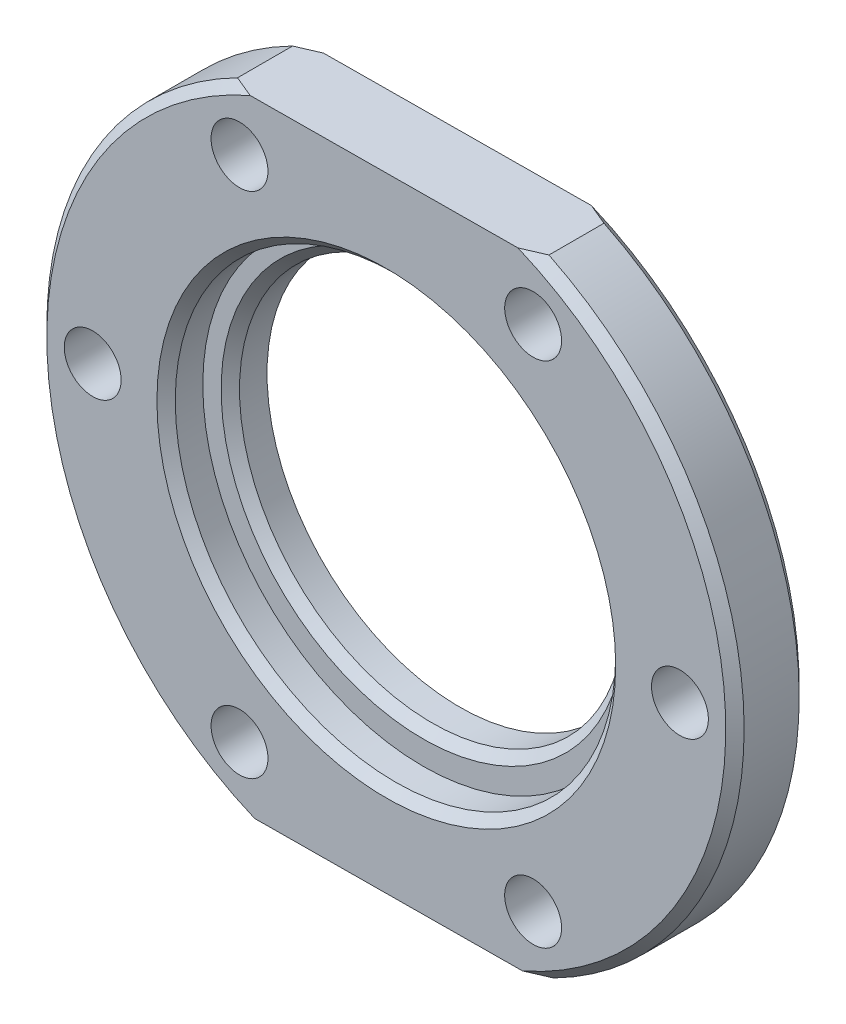
ISO-10303-21;
HEADER;
FILE_DESCRIPTION(('STEP AP214'),'2;1');
FILE_NAME('part.step','',(''),(''),'','','');
FILE_SCHEMA(('AUTOMOTIVE_DESIGN { 1 0 10303 214 1 1 1 1 }'));
ENDSEC;
DATA;
#1=APPLICATION_CONTEXT('core data for automotive mechanical design processes');
#2=APPLICATION_PROTOCOL_DEFINITION('international standard','automotive_design',2000,#1);
#3=PRODUCT_CONTEXT('',#1,'mechanical');
#4=PRODUCT('Part','Part','',(#3));
#5=PRODUCT_RELATED_PRODUCT_CATEGORY('part','',(#4));
#6=PRODUCT_DEFINITION_FORMATION('','',#4);
#7=PRODUCT_DEFINITION_CONTEXT('part definition',#1,'design');
#8=PRODUCT_DEFINITION('design','',#6,#7);
#9=PRODUCT_DEFINITION_SHAPE('','',#8);
#10=(LENGTH_UNIT() NAMED_UNIT(*) SI_UNIT(.MILLI.,.METRE.));
#11=(NAMED_UNIT(*) PLANE_ANGLE_UNIT() SI_UNIT($,.RADIAN.));
#12=(NAMED_UNIT(*) SI_UNIT($,.STERADIAN.) SOLID_ANGLE_UNIT());
#13=UNCERTAINTY_MEASURE_WITH_UNIT(LENGTH_MEASURE(1.E-05),#10,'distance_accuracy_value','');
#14=(GEOMETRIC_REPRESENTATION_CONTEXT(3) GLOBAL_UNCERTAINTY_ASSIGNED_CONTEXT((#13)) GLOBAL_UNIT_ASSIGNED_CONTEXT((#10,
#11,#12)) REPRESENTATION_CONTEXT('',''));
#15=CARTESIAN_POINT('',(0.,0.,0.));
#16=DIRECTION('',(0.,0.,1.));
#17=DIRECTION('',(1.,0.,0.));
#18=AXIS2_PLACEMENT_3D('',#15,#16,#17);
#19=CARTESIAN_POINT('',(0.,0.28978058219932,4.));
#20=DIRECTION('',(0.,0.,-1.));
#21=DIRECTION('',(-1.,0.,0.));
#22=AXIS2_PLACEMENT_3D('',#19,#20,#21);
#23=CYLINDRICAL_SURFACE('',#22,10.5);
#24=CARTESIAN_POINT('',(0.,0.28978058219932,1.49999999999998));
#25=DIRECTION('',(0.,0.,1.));
#26=DIRECTION('',(1.,0.,0.));
#27=AXIS2_PLACEMENT_3D('',#24,#25,#26);
#28=CIRCLE('',#27,10.5);
#29=CARTESIAN_POINT('',(10.5,0.28978058219932,1.49999999999998));
#30=VERTEX_POINT('',#29);
#31=EDGE_CURVE('E147',#30,#30,#28,.T.);
#32=ORIENTED_EDGE('',*,*,#31,.T.);
#33=EDGE_LOOP('',(#32));
#34=FACE_BOUND('',#33,.T.);
#35=CARTESIAN_POINT('',(0.,0.28978058219932,0.));
#36=DIRECTION('',(0.,0.,1.));
#37=DIRECTION('',(1.,0.,0.));
#38=AXIS2_PLACEMENT_3D('',#35,#36,#37);
#39=CIRCLE('',#38,10.5);
#40=CARTESIAN_POINT('',(10.5,0.28978058219932,0.));
#41=VERTEX_POINT('',#40);
#42=EDGE_CURVE('E133',#41,#41,#39,.T.);
#43=ORIENTED_EDGE('',*,*,#42,.F.);
#44=EDGE_LOOP('',(#43));
#45=FACE_BOUND('',#44,.T.);
#46=ADVANCED_FACE('F34',(#34,#45),#23,.F.);
#47=CARTESIAN_POINT('',(0.,0.,4.));
#48=DIRECTION('',(0.,0.,1.));
#49=DIRECTION('',(1.,0.,0.));
#50=AXIS2_PLACEMENT_3D('',#47,#48,#49);
#51=PLANE('',#50);
#52=CARTESIAN_POINT('',(0.,0.,4.));
#53=DIRECTION('',(0.,0.,1.));
#54=DIRECTION('',(1.,0.,0.));
#55=AXIS2_PLACEMENT_3D('',#52,#53,#54);
#56=CIRCLE('',#55,12.5);
#57=CARTESIAN_POINT('',(12.5,0.,4.));
#58=VERTEX_POINT('',#57);
#59=EDGE_CURVE('E156',#58,#58,#56,.F.);
#60=ORIENTED_EDGE('',*,*,#59,.T.);
#61=EDGE_LOOP('',(#60));
#62=FACE_BOUND('',#61,.T.);
#63=CARTESIAN_POINT('',(8.00149999999987,-13.8572724859549,4.));
#64=DIRECTION('',(0.,0.,1.));
#65=DIRECTION('',(1.,0.,0.));
#66=AXIS2_PLACEMENT_3D('',#63,#64,#65);
#67=CIRCLE('',#66,1.55);
#68=CARTESIAN_POINT('',(9.55149999999987,-13.8572724859549,4.));
#69=VERTEX_POINT('',#68);
#70=EDGE_CURVE('E326',#69,#69,#67,.T.);
#71=ORIENTED_EDGE('',*,*,#70,.F.);
#72=EDGE_LOOP('',(#71));
#73=FACE_BOUND('',#72,.T.);
#74=CARTESIAN_POINT('',(8.00150000000007,13.8572724859548,4.));
#75=DIRECTION('',(0.,0.,1.));
#76=DIRECTION('',(1.,0.,0.));
#77=AXIS2_PLACEMENT_3D('',#74,#75,#76);
#78=CIRCLE('',#77,1.55);
#79=CARTESIAN_POINT('',(9.55150000000006,13.8572724859548,4.));
#80=VERTEX_POINT('',#79);
#81=EDGE_CURVE('E338',#80,#80,#78,.T.);
#82=ORIENTED_EDGE('',*,*,#81,.F.);
#83=EDGE_LOOP('',(#82));
#84=FACE_BOUND('',#83,.T.);
#85=CARTESIAN_POINT('',(-16.,0.,4.));
#86=DIRECTION('',(0.,0.,1.));
#87=DIRECTION('',(1.,0.,0.));
#88=AXIS2_PLACEMENT_3D('',#85,#86,#87);
#89=CIRCLE('',#88,1.55);
#90=CARTESIAN_POINT('',(-14.45,0.,4.));
#91=VERTEX_POINT('',#90);
#92=EDGE_CURVE('E350',#91,#91,#89,.T.);
#93=ORIENTED_EDGE('',*,*,#92,.F.);
#94=EDGE_LOOP('',(#93));
#95=FACE_BOUND('',#94,.T.);
#96=DIRECTION('',(0.999974368868994,0.0071597210181551,0.));
#97=VECTOR('',#96,1.);
#98=CARTESIAN_POINT('',(-8.3633486295714,-17.060316518173,4.));
#99=LINE('',#98,#97);
#100=CARTESIAN_POINT('',(-7.1753574653337,-17.0518106148491,4.));
#101=VERTEX_POINT('',#100);
#102=CARTESIAN_POINT('',(7.41878797995096,-16.9473179266967,4.));
#103=VERTEX_POINT('',#102);
#104=EDGE_CURVE('E113',#101,#103,#99,.T.);
#105=ORIENTED_EDGE('',*,*,#104,.T.);
#106=CARTESIAN_POINT('',(0.,0.,4.));
#107=DIRECTION('',(0.,0.,1.));
#108=DIRECTION('',(1.,0.,0.));
#109=AXIS2_PLACEMENT_3D('',#106,#107,#108);
#110=CIRCLE('',#109,18.5);
#111=CARTESIAN_POINT('',(7.1753574653337,17.0518106148491,4.));
#112=VERTEX_POINT('',#111);
#113=EDGE_CURVE('E117',#103,#112,#110,.T.);
#114=ORIENTED_EDGE('',*,*,#113,.T.);
#115=DIRECTION('',(-0.999974368868994,-0.0071597210181549,0.));
#116=VECTOR('',#115,1.);
#117=CARTESIAN_POINT('',(-8.60677914418868,16.9388120233728,4.));
#118=LINE('',#117,#116);
#119=CARTESIAN_POINT('',(-7.41878797995098,16.9473179266967,4.));
#120=VERTEX_POINT('',#119);
#121=EDGE_CURVE('E116',#112,#120,#118,.T.);
#122=ORIENTED_EDGE('',*,*,#121,.T.);
#123=CARTESIAN_POINT('',(0.,0.,4.));
#124=DIRECTION('',(0.,0.,1.));
#125=DIRECTION('',(1.,0.,0.));
#126=AXIS2_PLACEMENT_3D('',#123,#124,#125);
#127=CIRCLE('',#126,18.5);
#128=EDGE_CURVE('E104',#120,#101,#127,.T.);
#129=ORIENTED_EDGE('',*,*,#128,.T.);
#130=EDGE_LOOP('',(#105,#114,#122,#129));
#131=FACE_BOUND('',#130,.T.);
#132=CARTESIAN_POINT('',(-7.99949999999997,13.8572724859548,4.));
#133=DIRECTION('',(0.,0.,1.));
#134=DIRECTION('',(1.,0.,0.));
#135=AXIS2_PLACEMENT_3D('',#132,#133,#134);
#136=CIRCLE('',#135,1.55);
#137=CARTESIAN_POINT('',(-6.44949999999997,13.8572724859548,4.));
#138=VERTEX_POINT('',#137);
#139=EDGE_CURVE('E344',#138,#138,#136,.T.);
#140=ORIENTED_EDGE('',*,*,#139,.F.);
#141=EDGE_LOOP('',(#140));
#142=FACE_BOUND('',#141,.T.);
#143=CARTESIAN_POINT('',(16.002,-1.11706453954947E-13,4.));
#144=DIRECTION('',(0.,0.,1.));
#145=DIRECTION('',(1.,0.,0.));
#146=AXIS2_PLACEMENT_3D('',#143,#144,#145);
#147=CIRCLE('',#146,1.55);
#148=CARTESIAN_POINT('',(17.552,-1.11706453954947E-13,4.));
#149=VERTEX_POINT('',#148);
#150=EDGE_CURVE('E332',#149,#149,#147,.T.);
#151=ORIENTED_EDGE('',*,*,#150,.F.);
#152=EDGE_LOOP('',(#151));
#153=FACE_BOUND('',#152,.T.);
#154=CARTESIAN_POINT('',(-7.99950000000016,-13.8572724859547,4.));
#155=DIRECTION('',(0.,0.,1.));
#156=DIRECTION('',(1.,0.,0.));
#157=AXIS2_PLACEMENT_3D('',#154,#155,#156);
#158=CIRCLE('',#157,1.55);
#159=CARTESIAN_POINT('',(-6.44950000000016,-13.8572724859547,4.));
#160=VERTEX_POINT('',#159);
#161=EDGE_CURVE('E320',#160,#160,#158,.T.);
#162=ORIENTED_EDGE('',*,*,#161,.F.);
#163=EDGE_LOOP('',(#162));
#164=FACE_BOUND('',#163,.T.);
#165=ADVANCED_FACE('F110',(#62,#73,#84,#95,#131,#142,#153,#164),#51,.T.);
#166=CARTESIAN_POINT('',(0.,0.,0.));
#167=DIRECTION('',(0.,0.,1.));
#168=DIRECTION('',(1.,0.,0.));
#169=AXIS2_PLACEMENT_3D('',#166,#167,#168);
#170=PLANE('',#169);
#171=DIRECTION('',(-0.999974368868994,-0.0071597210181549,0.));
#172=VECTOR('',#171,1.);
#173=CARTESIAN_POINT('',(-8.60677914418868,16.9388120233728,0.));
#174=LINE('',#173,#172);
#175=CARTESIAN_POINT('',(7.17535746533372,17.0518106148491,0.));
#176=VERTEX_POINT('',#175);
#177=CARTESIAN_POINT('',(-7.41878797995099,16.9473179266967,0.));
#178=VERTEX_POINT('',#177);
#179=EDGE_CURVE('E125',#176,#178,#174,.T.);
#180=ORIENTED_EDGE('',*,*,#179,.F.);
#181=CARTESIAN_POINT('',(0.,0.,0.));
#182=DIRECTION('',(0.,0.,1.));
#183=DIRECTION('',(1.,0.,0.));
#184=AXIS2_PLACEMENT_3D('',#181,#182,#183);
#185=CIRCLE('',#184,18.5);
#186=CARTESIAN_POINT('',(7.41878797995098,-16.9473179266967,0.));
#187=VERTEX_POINT('',#186);
#188=EDGE_CURVE('E105',#176,#187,#185,.F.);
#189=ORIENTED_EDGE('',*,*,#188,.T.);
#190=DIRECTION('',(0.999974368868994,0.0071597210181551,0.));
#191=VECTOR('',#190,1.);
#192=CARTESIAN_POINT('',(-8.3633486295714,-17.060316518173,0.));
#193=LINE('',#192,#191);
#194=CARTESIAN_POINT('',(-7.1753574653337,-17.0518106148491,0.));
#195=VERTEX_POINT('',#194);
#196=EDGE_CURVE('E130',#195,#187,#193,.T.);
#197=ORIENTED_EDGE('',*,*,#196,.F.);
#198=CARTESIAN_POINT('',(0.,0.,0.));
#199=DIRECTION('',(0.,0.,1.));
#200=DIRECTION('',(1.,0.,0.));
#201=AXIS2_PLACEMENT_3D('',#198,#199,#200);
#202=CIRCLE('',#201,18.5);
#203=EDGE_CURVE('E249',#195,#178,#202,.F.);
#204=ORIENTED_EDGE('',*,*,#203,.T.);
#205=EDGE_LOOP('',(#180,#189,#197,#204));
#206=FACE_BOUND('',#205,.T.);
#207=ORIENTED_EDGE('',*,*,#42,.T.);
#208=EDGE_LOOP('',(#207));
#209=FACE_BOUND('',#208,.T.);
#210=CARTESIAN_POINT('',(-16.,0.,0.));
#211=DIRECTION('',(0.,0.,1.));
#212=DIRECTION('',(1.,0.,0.));
#213=AXIS2_PLACEMENT_3D('',#210,#211,#212);
#214=CIRCLE('',#213,1.55);
#215=CARTESIAN_POINT('',(-14.45,0.,0.));
#216=VERTEX_POINT('',#215);
#217=EDGE_CURVE('E347',#216,#216,#214,.T.);
#218=ORIENTED_EDGE('',*,*,#217,.T.);
#219=EDGE_LOOP('',(#218));
#220=FACE_BOUND('',#219,.T.);
#221=CARTESIAN_POINT('',(-7.99949999999997,13.8572724859548,0.));
#222=DIRECTION('',(0.,0.,1.));
#223=DIRECTION('',(1.,0.,0.));
#224=AXIS2_PLACEMENT_3D('',#221,#222,#223);
#225=CIRCLE('',#224,1.55);
#226=CARTESIAN_POINT('',(-6.44949999999997,13.8572724859548,0.));
#227=VERTEX_POINT('',#226);
#228=EDGE_CURVE('E341',#227,#227,#225,.T.);
#229=ORIENTED_EDGE('',*,*,#228,.T.);
#230=EDGE_LOOP('',(#229));
#231=FACE_BOUND('',#230,.T.);
#232=CARTESIAN_POINT('',(8.00150000000007,13.8572724859548,0.));
#233=DIRECTION('',(0.,0.,1.));
#234=DIRECTION('',(1.,0.,0.));
#235=AXIS2_PLACEMENT_3D('',#232,#233,#234);
#236=CIRCLE('',#235,1.55);
#237=CARTESIAN_POINT('',(9.55150000000006,13.8572724859548,0.));
#238=VERTEX_POINT('',#237);
#239=EDGE_CURVE('E335',#238,#238,#236,.T.);
#240=ORIENTED_EDGE('',*,*,#239,.T.);
#241=EDGE_LOOP('',(#240));
#242=FACE_BOUND('',#241,.T.);
#243=CARTESIAN_POINT('',(16.002,-1.11706453954947E-13,0.));
#244=DIRECTION('',(0.,0.,1.));
#245=DIRECTION('',(1.,0.,0.));
#246=AXIS2_PLACEMENT_3D('',#243,#244,#245);
#247=CIRCLE('',#246,1.55);
#248=CARTESIAN_POINT('',(17.552,-1.11706453954947E-13,0.));
#249=VERTEX_POINT('',#248);
#250=EDGE_CURVE('E329',#249,#249,#247,.T.);
#251=ORIENTED_EDGE('',*,*,#250,.T.);
#252=EDGE_LOOP('',(#251));
#253=FACE_BOUND('',#252,.T.);
#254=CARTESIAN_POINT('',(8.00149999999987,-13.8572724859549,0.));
#255=DIRECTION('',(0.,0.,1.));
#256=DIRECTION('',(1.,0.,0.));
#257=AXIS2_PLACEMENT_3D('',#254,#255,#256);
#258=CIRCLE('',#257,1.55);
#259=CARTESIAN_POINT('',(9.55149999999987,-13.8572724859549,0.));
#260=VERTEX_POINT('',#259);
#261=EDGE_CURVE('E324',#260,#260,#258,.T.);
#262=ORIENTED_EDGE('',*,*,#261,.T.);
#263=EDGE_LOOP('',(#262));
#264=FACE_BOUND('',#263,.T.);
#265=CARTESIAN_POINT('',(-7.99950000000016,-13.8572724859547,0.));
#266=DIRECTION('',(0.,0.,1.));
#267=DIRECTION('',(1.,0.,0.));
#268=AXIS2_PLACEMENT_3D('',#265,#266,#267);
#269=CIRCLE('',#268,1.55);
#270=CARTESIAN_POINT('',(-6.44950000000016,-13.8572724859547,0.));
#271=VERTEX_POINT('',#270);
#272=EDGE_CURVE('E317',#271,#271,#269,.T.);
#273=ORIENTED_EDGE('',*,*,#272,.T.);
#274=EDGE_LOOP('',(#273));
#275=FACE_BOUND('',#274,.T.);
#276=ADVANCED_FACE('F185',(#206,#209,#220,#231,#242,#253,#264,#275),#170,.F.);
#277=CARTESIAN_POINT('',(0.,0.,4.));
#278=DIRECTION('',(0.,0.,-1.));
#279=DIRECTION('',(-1.,0.,0.));
#280=AXIS2_PLACEMENT_3D('',#277,#278,#279);
#281=CYLINDRICAL_SURFACE('',#280,19.);
#282=DIRECTION('',(0.,0.,-1.));
#283=VECTOR('',#282,1.);
#284=CARTESIAN_POINT('',(-8.60677914418868,16.9388120233728,4.));
#285=LINE('',#284,#283);
#286=CARTESIAN_POINT('',(-8.60677914418868,16.9388120233728,3.5));
#287=VERTEX_POINT('',#286);
#288=CARTESIAN_POINT('',(-8.60677914418868,16.9388120233728,0.49999999999999));
#289=VERTEX_POINT('',#288);
#290=EDGE_CURVE('E127',#287,#289,#285,.T.);
#291=ORIENTED_EDGE('',*,*,#290,.T.);
#292=CARTESIAN_POINT('',(0.,0.,0.49999999999999));
#293=DIRECTION('',(0.,0.,1.));
#294=DIRECTION('',(1.,0.,0.));
#295=AXIS2_PLACEMENT_3D('',#292,#293,#294);
#296=CIRCLE('',#295,19.);
#297=CARTESIAN_POINT('',(-8.3633486295714,-17.060316518173,0.49999999999999));
#298=VERTEX_POINT('',#297);
#299=EDGE_CURVE('E11',#289,#298,#296,.T.);
#300=ORIENTED_EDGE('',*,*,#299,.T.);
#301=DIRECTION('',(0.,0.,-1.));
#302=VECTOR('',#301,1.);
#303=CARTESIAN_POINT('',(-8.3633486295714,-17.060316518173,4.));
#304=LINE('',#303,#302);
#305=CARTESIAN_POINT('',(-8.3633486295714,-17.060316518173,3.5));
#306=VERTEX_POINT('',#305);
#307=EDGE_CURVE('E145',#306,#298,#304,.T.);
#308=ORIENTED_EDGE('',*,*,#307,.F.);
#309=CARTESIAN_POINT('',(0.,0.,3.5));
#310=DIRECTION('',(0.,0.,1.));
#311=DIRECTION('',(1.,0.,0.));
#312=AXIS2_PLACEMENT_3D('',#309,#310,#311);
#313=CIRCLE('',#312,19.);
#314=EDGE_CURVE('E44',#306,#287,#313,.F.);
#315=ORIENTED_EDGE('',*,*,#314,.T.);
#316=EDGE_LOOP('',(#291,#300,#308,#315));
#317=FACE_BOUND('',#316,.T.);
#318=ADVANCED_FACE('F239',(#317),#281,.T.);
#319=CARTESIAN_POINT('',(-8.3633486295714,-17.060316518173,4.));
#320=DIRECTION('',(-0.0071597210181551,0.999974368868994,0.));
#321=DIRECTION('',(-0.999974368868994,-0.0071597210181551,0.));
#322=AXIS2_PLACEMENT_3D('',#319,#320,#321);
#323=PLANE('',#322);
#324=ORIENTED_EDGE('',*,*,#196,.T.);
#325=CARTESIAN_POINT('',(7.41878797995098,-16.9473179266967,0.));
#326=CARTESIAN_POINT('',(7.51872053832114,-16.9466024191189,0.0394191850347703));
#327=CARTESIAN_POINT('',(7.61841932959364,-16.9458885852911,0.0794296704768748));
#328=CARTESIAN_POINT('',(7.81734002522007,-16.9444643321005,0.160584933755767));
#329=CARTESIAN_POINT('',(7.91656198656083,-16.9437539123296,0.201729571878797));
#330=CARTESIAN_POINT('',(8.11454364993631,-16.9423363825202,0.28511429899463));
#331=CARTESIAN_POINT('',(8.21330335444375,-16.9416292724641,0.32735438211974));
#332=CARTESIAN_POINT('',(8.41037735410185,-16.9402182414402,0.412894043845007));
#333=CARTESIAN_POINT('',(8.50869159313468,-16.9395143208744,0.456193751762991));
#334=CARTESIAN_POINT('',(8.60677914418869,-16.9388120233728,0.499999999999977));
#335=B_SPLINE_CURVE_WITH_KNOTS('',3,(#325,#326,#327,#328,#329,#330,#331,#332,#333,#334),
.UNSPECIFIED.,.F.,.F.,(4,2,2,2,4),(0.,0.322283148753807,0.64452677203784,0.966768669597213,
1.28905009200686),.UNSPECIFIED.);
#336=CARTESIAN_POINT('',(8.60677914418868,-16.9388120233728,0.49999999999999));
#337=VERTEX_POINT('',#336);
#338=EDGE_CURVE('E227',#187,#337,#335,.T.);
#339=ORIENTED_EDGE('',*,*,#338,.T.);
#340=DIRECTION('',(0.,0.,-1.));
#341=VECTOR('',#340,1.);
#342=CARTESIAN_POINT('',(8.60677914418868,-16.9388120233728,4.));
#343=LINE('',#342,#341);
#344=CARTESIAN_POINT('',(8.60677914418868,-16.9388120233728,3.5));
#345=VERTEX_POINT('',#344);
#346=EDGE_CURVE('E142',#345,#337,#343,.T.);
#347=ORIENTED_EDGE('',*,*,#346,.F.);
#348=CARTESIAN_POINT('',(8.60677914418868,-16.9388120233728,3.5));
#349=CARTESIAN_POINT('',(8.50869159313468,-16.9395143208744,3.54380624823699));
#350=CARTESIAN_POINT('',(8.41037735410185,-16.9402182414402,3.58710595615498));
#351=CARTESIAN_POINT('',(8.21330335444375,-16.9416292724641,3.67264561788026));
#352=CARTESIAN_POINT('',(8.11454364993631,-16.9423363825202,3.71488570100537));
#353=CARTESIAN_POINT('',(7.91656198656082,-16.9437539123296,3.7982704281212));
#354=CARTESIAN_POINT('',(7.81734002522006,-16.9444643321005,3.83941506624422));
#355=CARTESIAN_POINT('',(7.61841932959362,-16.9458885852911,3.92057032952312));
#356=CARTESIAN_POINT('',(7.51872053832112,-16.9466024191189,3.96058081496523));
#357=CARTESIAN_POINT('',(7.41878797995097,-16.9473179266967,4.00000000000002));
#358=B_SPLINE_CURVE_WITH_KNOTS('',3,(#348,#349,#350,#351,#352,#353,#354,#355,#356,#357),
.UNSPECIFIED.,.F.,.F.,(4,2,2,2,4),(0.,0.32228142240965,0.644523319969029,0.966766943253067,
1.28905009200688),.UNSPECIFIED.);
#359=EDGE_CURVE('E124',#345,#103,#358,.T.);
#360=ORIENTED_EDGE('',*,*,#359,.T.);
#361=ORIENTED_EDGE('',*,*,#104,.F.);
#362=CARTESIAN_POINT('',(-7.1753574653337,-17.0518106148491,4.));
#363=CARTESIAN_POINT('',(-7.27529002370385,-17.0525261224269,3.96058081496523));
#364=CARTESIAN_POINT('',(-7.37498881497636,-17.0532399562547,3.92057032952312));
#365=CARTESIAN_POINT('',(-7.5739095106028,-17.0546642094453,3.83941506624423));
#366=CARTESIAN_POINT('',(-7.67313147194355,-17.0553746292162,3.7982704281212));
#367=CARTESIAN_POINT('',(-7.87111313531904,-17.0567921590256,3.71488570100537));
#368=CARTESIAN_POINT('',(-7.96987283982647,-17.0574992690817,3.67264561788026));
#369=CARTESIAN_POINT('',(-8.16694683948458,-17.0589103001055,3.58710595615499));
#370=CARTESIAN_POINT('',(-8.2652610785174,-17.0596142206714,3.543806248237));
#371=CARTESIAN_POINT('',(-8.36334862957141,-17.060316518173,3.50000000000001));
#372=B_SPLINE_CURVE_WITH_KNOTS('',3,(#362,#363,#364,#365,#366,#367,#368,#369,#370,#371),
.UNSPECIFIED.,.F.,.F.,(4,2,2,2,4),(0.,0.32228314875381,0.644526772037846,0.96676866959722,
1.28905009200687),.UNSPECIFIED.);
#373=EDGE_CURVE('E58',#101,#306,#372,.T.);
#374=ORIENTED_EDGE('',*,*,#373,.T.);
#375=ORIENTED_EDGE('',*,*,#307,.T.);
#376=CARTESIAN_POINT('',(-8.3633486295714,-17.060316518173,0.49999999999999));
#377=CARTESIAN_POINT('',(-8.2652610785174,-17.0596142206714,0.456193751762995));
#378=CARTESIAN_POINT('',(-8.16694683948458,-17.0589103001055,0.412894043845007));
#379=CARTESIAN_POINT('',(-7.96987283982647,-17.0574992690817,0.327354382119737));
#380=CARTESIAN_POINT('',(-7.87111313531904,-17.0567921590256,0.285114298994628));
#381=CARTESIAN_POINT('',(-7.67313147194356,-17.0553746292162,0.201729571878797));
#382=CARTESIAN_POINT('',(-7.5739095106028,-17.0546642094453,0.16058493375577));
#383=CARTESIAN_POINT('',(-7.37498881497636,-17.0532399562547,0.0794296704768728));
#384=CARTESIAN_POINT('',(-7.27529002370387,-17.0525261224269,0.039419185034762));
#385=CARTESIAN_POINT('',(-7.17535746533372,-17.0518106148491,0.));
#386=B_SPLINE_CURVE_WITH_KNOTS('',3,(#376,#377,#378,#379,#380,#381,#382,#383,#384,#385),
.UNSPECIFIED.,.F.,.F.,(4,2,2,2,4),(0.,0.322281422409645,0.644523319969017,0.966766943253049,
1.28905009200685),.UNSPECIFIED.);
#387=EDGE_CURVE('E51',#298,#195,#386,.T.);
#388=ORIENTED_EDGE('',*,*,#387,.T.);
#389=EDGE_LOOP('',(#324,#339,#347,#360,#361,#374,#375,#388));
#390=FACE_BOUND('',#389,.T.);
#391=ADVANCED_FACE('F121',(#390),#323,.F.);
#392=CARTESIAN_POINT('',(0.,0.,4.));
#393=DIRECTION('',(0.,0.,-1.));
#394=DIRECTION('',(-1.,0.,0.));
#395=AXIS2_PLACEMENT_3D('',#392,#393,#394);
#396=CYLINDRICAL_SURFACE('',#395,19.);
#397=ORIENTED_EDGE('',*,*,#346,.T.);
#398=CARTESIAN_POINT('',(0.,0.,0.49999999999999));
#399=DIRECTION('',(0.,0.,1.));
#400=DIRECTION('',(1.,0.,0.));
#401=AXIS2_PLACEMENT_3D('',#398,#399,#400);
#402=CIRCLE('',#401,19.);
#403=CARTESIAN_POINT('',(8.36334862957141,17.060316518173,0.49999999999999));
#404=VERTEX_POINT('',#403);
#405=EDGE_CURVE('E161',#337,#404,#402,.T.);
#406=ORIENTED_EDGE('',*,*,#405,.T.);
#407=DIRECTION('',(0.,0.,-1.));
#408=VECTOR('',#407,1.);
#409=CARTESIAN_POINT('',(8.36334862957141,17.060316518173,4.));
#410=LINE('',#409,#408);
#411=CARTESIAN_POINT('',(8.36334862957141,17.060316518173,3.5));
#412=VERTEX_POINT('',#411);
#413=EDGE_CURVE('E139',#412,#404,#410,.T.);
#414=ORIENTED_EDGE('',*,*,#413,.F.);
#415=CARTESIAN_POINT('',(0.,0.,3.5));
#416=DIRECTION('',(0.,0.,1.));
#417=DIRECTION('',(1.,0.,0.));
#418=AXIS2_PLACEMENT_3D('',#415,#416,#417);
#419=CIRCLE('',#418,19.);
#420=EDGE_CURVE('E159',#412,#345,#419,.F.);
#421=ORIENTED_EDGE('',*,*,#420,.T.);
#422=EDGE_LOOP('',(#397,#406,#414,#421));
#423=FACE_BOUND('',#422,.T.);
#424=ADVANCED_FACE('F183',(#423),#396,.T.);
#425=CARTESIAN_POINT('',(-8.60677914418868,16.9388120233728,4.));
#426=DIRECTION('',(0.0071597210181549,-0.999974368868994,0.));
#427=DIRECTION('',(0.999974368868994,0.0071597210181549,0.));
#428=AXIS2_PLACEMENT_3D('',#425,#426,#427);
#429=PLANE('',#428);
#430=ORIENTED_EDGE('',*,*,#413,.T.);
#431=CARTESIAN_POINT('',(8.36334862957141,17.060316518173,0.49999999999999));
#432=CARTESIAN_POINT('',(8.26526107851741,17.0596142206714,0.456193751762996));
#433=CARTESIAN_POINT('',(8.16694683948458,17.0589103001055,0.412894043845007));
#434=CARTESIAN_POINT('',(7.96987283982648,17.0574992690817,0.327354382119737));
#435=CARTESIAN_POINT('',(7.87111313531905,17.0567921590256,0.285114298994627));
#436=CARTESIAN_POINT('',(7.67313147194357,17.0553746292162,0.201729571878798));
#437=CARTESIAN_POINT('',(7.57390951060281,17.0546642094453,0.160584933755772));
#438=CARTESIAN_POINT('',(7.37498881497638,17.0532399562546,0.0794296704768768));
#439=CARTESIAN_POINT('',(7.27529002370388,17.0525261224269,0.0394191850347657));
#440=CARTESIAN_POINT('',(7.17535746533373,17.0518106148491,0.));
#441=B_SPLINE_CURVE_WITH_KNOTS('',3,(#431,#432,#433,#434,#435,#436,#437,#438,#439,#440),
.UNSPECIFIED.,.F.,.F.,(4,2,2,2,4),(0.,0.322281422409643,0.644523319969014,0.966766943253044,
1.28905009200685),.UNSPECIFIED.);
#442=EDGE_CURVE('E198',#404,#176,#441,.T.);
#443=ORIENTED_EDGE('',*,*,#442,.T.);
#444=ORIENTED_EDGE('',*,*,#179,.T.);
#445=CARTESIAN_POINT('',(-7.41878797995099,16.9473179266967,0.));
#446=CARTESIAN_POINT('',(-7.51872053832114,16.9466024191189,0.0394191850347729));
#447=CARTESIAN_POINT('',(-7.61841932959364,16.9458885852911,0.0794296704768779));
#448=CARTESIAN_POINT('',(-7.81734002522008,16.9444643321005,0.16058493375577));
#449=CARTESIAN_POINT('',(-7.91656198656083,16.9437539123296,0.201729571878798));
#450=CARTESIAN_POINT('',(-8.11454364993632,16.9423363825202,0.28511429899463));
#451=CARTESIAN_POINT('',(-8.21330335444375,16.9416292724641,0.327354382119739));
#452=CARTESIAN_POINT('',(-8.41037735410185,16.9402182414402,0.412894043845006));
#453=CARTESIAN_POINT('',(-8.50869159313468,16.9395143208744,0.456193751762991));
#454=CARTESIAN_POINT('',(-8.60677914418869,16.9388120233728,0.499999999999977));
#455=B_SPLINE_CURVE_WITH_KNOTS('',3,(#445,#446,#447,#448,#449,#450,#451,#452,#453,#454),
.UNSPECIFIED.,.F.,.F.,(4,2,2,2,4),(0.,0.322283148753807,0.644526772037839,0.966768669597212,
1.28905009200686),.UNSPECIFIED.);
#456=EDGE_CURVE('E171',#178,#289,#455,.T.);
#457=ORIENTED_EDGE('',*,*,#456,.T.);
#458=ORIENTED_EDGE('',*,*,#290,.F.);
#459=CARTESIAN_POINT('',(-8.60677914418868,16.9388120233728,3.5));
#460=CARTESIAN_POINT('',(-8.50869159313468,16.9395143208744,3.54380624823699));
#461=CARTESIAN_POINT('',(-8.41037735410185,16.9402182414402,3.58710595615498));
#462=CARTESIAN_POINT('',(-8.21330335444375,16.9416292724641,3.67264561788026));
#463=CARTESIAN_POINT('',(-8.11454364993631,16.9423363825202,3.71488570100537));
#464=CARTESIAN_POINT('',(-7.91656198656083,16.9437539123296,3.7982704281212));
#465=CARTESIAN_POINT('',(-7.81734002522007,16.9444643321005,3.83941506624422));
#466=CARTESIAN_POINT('',(-7.61841932959363,16.9458885852911,3.92057032952312));
#467=CARTESIAN_POINT('',(-7.51872053832113,16.9466024191189,3.96058081496523));
#468=CARTESIAN_POINT('',(-7.41878797995099,16.9473179266967,4.00000000000002));
#469=B_SPLINE_CURVE_WITH_KNOTS('',3,(#459,#460,#461,#462,#463,#464,#465,#466,#467,#468),
.UNSPECIFIED.,.F.,.F.,(4,2,2,2,4),(0.,0.322281422409651,0.644523319969025,0.966766943253059,
1.28905009200687),.UNSPECIFIED.);
#470=EDGE_CURVE('E164',#287,#120,#469,.T.);
#471=ORIENTED_EDGE('',*,*,#470,.T.);
#472=ORIENTED_EDGE('',*,*,#121,.F.);
#473=CARTESIAN_POINT('',(7.1753574653337,17.0518106148491,4.));
#474=CARTESIAN_POINT('',(7.27529002370386,17.0525261224269,3.96058081496523));
#475=CARTESIAN_POINT('',(7.37498881497636,17.0532399562546,3.92057032952312));
#476=CARTESIAN_POINT('',(7.5739095106028,17.0546642094453,3.83941506624423));
#477=CARTESIAN_POINT('',(7.67313147194356,17.0553746292162,3.7982704281212));
#478=CARTESIAN_POINT('',(7.87111313531904,17.0567921590256,3.71488570100536));
#479=CARTESIAN_POINT('',(7.96987283982647,17.0574992690817,3.67264561788025));
#480=CARTESIAN_POINT('',(8.16694683948458,17.0589103001055,3.58710595615499));
#481=CARTESIAN_POINT('',(8.26526107851741,17.0596142206714,3.543806248237));
#482=CARTESIAN_POINT('',(8.36334862957142,17.060316518173,3.50000000000001));
#483=B_SPLINE_CURVE_WITH_KNOTS('',3,(#473,#474,#475,#476,#477,#478,#479,#480,#481,#482),
.UNSPECIFIED.,.F.,.F.,(4,2,2,2,4),(0.,0.32228314875381,0.644526772037846,0.966768669597222,
1.28905009200687),.UNSPECIFIED.);
#484=EDGE_CURVE('E192',#112,#412,#483,.T.);
#485=ORIENTED_EDGE('',*,*,#484,.T.);
#486=EDGE_LOOP('',(#430,#443,#444,#457,#458,#471,#472,#485));
#487=FACE_BOUND('',#486,.T.);
#488=ADVANCED_FACE('F177',(#487),#429,.F.);
#489=CARTESIAN_POINT('',(-16.,0.,4.));
#490=DIRECTION('',(0.,0.,-1.));
#491=DIRECTION('',(-1.,0.,0.));
#492=AXIS2_PLACEMENT_3D('',#489,#490,#491);
#493=CYLINDRICAL_SURFACE('',#492,1.55);
#494=ORIENTED_EDGE('',*,*,#92,.T.);
#495=EDGE_LOOP('',(#494));
#496=FACE_BOUND('',#495,.T.);
#497=ORIENTED_EDGE('',*,*,#217,.F.);
#498=EDGE_LOOP('',(#497));
#499=FACE_BOUND('',#498,.T.);
#500=ADVANCED_FACE('F182',(#496,#499),#493,.F.);
#501=CARTESIAN_POINT('',(-7.99949999999997,13.8572724859548,4.));
#502=DIRECTION('',(0.,0.,-1.));
#503=DIRECTION('',(-1.,0.,0.));
#504=AXIS2_PLACEMENT_3D('',#501,#502,#503);
#505=CYLINDRICAL_SURFACE('',#504,1.55);
#506=ORIENTED_EDGE('',*,*,#139,.T.);
#507=EDGE_LOOP('',(#506));
#508=FACE_BOUND('',#507,.T.);
#509=ORIENTED_EDGE('',*,*,#228,.F.);
#510=EDGE_LOOP('',(#509));
#511=FACE_BOUND('',#510,.T.);
#512=ADVANCED_FACE('F277',(#508,#511),#505,.F.);
#513=CARTESIAN_POINT('',(8.00150000000007,13.8572724859548,4.));
#514=DIRECTION('',(0.,0.,-1.));
#515=DIRECTION('',(-1.,0.,0.));
#516=AXIS2_PLACEMENT_3D('',#513,#514,#515);
#517=CYLINDRICAL_SURFACE('',#516,1.55);
#518=ORIENTED_EDGE('',*,*,#81,.T.);
#519=EDGE_LOOP('',(#518));
#520=FACE_BOUND('',#519,.T.);
#521=ORIENTED_EDGE('',*,*,#239,.F.);
#522=EDGE_LOOP('',(#521));
#523=FACE_BOUND('',#522,.T.);
#524=ADVANCED_FACE('F281',(#520,#523),#517,.F.);
#525=CARTESIAN_POINT('',(16.002,-1.11706453954947E-13,4.));
#526=DIRECTION('',(0.,0.,-1.));
#527=DIRECTION('',(-1.,0.,0.));
#528=AXIS2_PLACEMENT_3D('',#525,#526,#527);
#529=CYLINDRICAL_SURFACE('',#528,1.55);
#530=ORIENTED_EDGE('',*,*,#150,.T.);
#531=EDGE_LOOP('',(#530));
#532=FACE_BOUND('',#531,.T.);
#533=ORIENTED_EDGE('',*,*,#250,.F.);
#534=EDGE_LOOP('',(#533));
#535=FACE_BOUND('',#534,.T.);
#536=ADVANCED_FACE('F285',(#532,#535),#529,.F.);
#537=CARTESIAN_POINT('',(8.00149999999987,-13.8572724859549,4.));
#538=DIRECTION('',(0.,0.,-1.));
#539=DIRECTION('',(-1.,0.,0.));
#540=AXIS2_PLACEMENT_3D('',#537,#538,#539);
#541=CYLINDRICAL_SURFACE('',#540,1.55);
#542=ORIENTED_EDGE('',*,*,#70,.T.);
#543=EDGE_LOOP('',(#542));
#544=FACE_BOUND('',#543,.T.);
#545=ORIENTED_EDGE('',*,*,#261,.F.);
#546=EDGE_LOOP('',(#545));
#547=FACE_BOUND('',#546,.T.);
#548=ADVANCED_FACE('F289',(#544,#547),#541,.F.);
#549=CARTESIAN_POINT('',(-7.99950000000016,-13.8572724859547,4.));
#550=DIRECTION('',(0.,0.,-1.));
#551=DIRECTION('',(-1.,0.,0.));
#552=AXIS2_PLACEMENT_3D('',#549,#550,#551);
#553=CYLINDRICAL_SURFACE('',#552,1.55);
#554=ORIENTED_EDGE('',*,*,#161,.T.);
#555=EDGE_LOOP('',(#554));
#556=FACE_BOUND('',#555,.T.);
#557=ORIENTED_EDGE('',*,*,#272,.F.);
#558=EDGE_LOOP('',(#557));
#559=FACE_BOUND('',#558,.T.);
#560=ADVANCED_FACE('F293',(#556,#559),#553,.F.);
#561=CARTESIAN_POINT('',(0.,0.,2.));
#562=DIRECTION('',(0.,0.,1.));
#563=DIRECTION('',(1.,0.,0.));
#564=AXIS2_PLACEMENT_3D('',#561,#562,#563);
#565=CYLINDRICAL_SURFACE('',#564,12.);
#566=CARTESIAN_POINT('',(0.,0.,3.49999999999999));
#567=DIRECTION('',(0.,0.,1.));
#568=DIRECTION('',(1.,0.,0.));
#569=AXIS2_PLACEMENT_3D('',#566,#567,#568);
#570=CIRCLE('',#569,12.);
#571=CARTESIAN_POINT('',(12.,0.,3.49999999999999));
#572=VERTEX_POINT('',#571);
#573=EDGE_CURVE('E118',#572,#572,#570,.T.);
#574=ORIENTED_EDGE('',*,*,#573,.T.);
#575=EDGE_LOOP('',(#574));
#576=FACE_BOUND('',#575,.T.);
#577=CARTESIAN_POINT('',(0.,0.,2.));
#578=DIRECTION('',(0.,0.,1.));
#579=DIRECTION('',(1.,0.,0.));
#580=AXIS2_PLACEMENT_3D('',#577,#578,#579);
#581=CIRCLE('',#580,12.);
#582=CARTESIAN_POINT('',(12.,0.,2.));
#583=VERTEX_POINT('',#582);
#584=EDGE_CURVE('E315',#583,#583,#581,.T.);
#585=ORIENTED_EDGE('',*,*,#584,.F.);
#586=EDGE_LOOP('',(#585));
#587=FACE_BOUND('',#586,.T.);
#588=ADVANCED_FACE('F297',(#576,#587),#565,.F.);
#589=CARTESIAN_POINT('',(0.,0.,2.));
#590=DIRECTION('',(0.,0.,1.));
#591=DIRECTION('',(1.,0.,0.));
#592=AXIS2_PLACEMENT_3D('',#589,#590,#591);
#593=PLANE('',#592);
#594=CARTESIAN_POINT('',(0.,0.28978058219932,2.));
#595=DIRECTION('',(0.,0.,1.));
#596=DIRECTION('',(1.,0.,0.));
#597=AXIS2_PLACEMENT_3D('',#594,#595,#596);
#598=CIRCLE('',#597,11.);
#599=CARTESIAN_POINT('',(11.,0.28978058219932,2.));
#600=VERTEX_POINT('',#599);
#601=EDGE_CURVE('E150',#600,#600,#598,.F.);
#602=ORIENTED_EDGE('',*,*,#601,.T.);
#603=EDGE_LOOP('',(#602));
#604=FACE_BOUND('',#603,.T.);
#605=ORIENTED_EDGE('',*,*,#584,.T.);
#606=EDGE_LOOP('',(#605));
#607=FACE_BOUND('',#606,.T.);
#608=ADVANCED_FACE('F301',(#604,#607),#593,.T.);
#609=CARTESIAN_POINT('',(0.,0.28978058219932,1.49999999999998));
#610=DIRECTION('',(0.,0.,1.));
#611=DIRECTION('',(1.,0.,0.));
#612=AXIS2_PLACEMENT_3D('',#609,#610,#611);
#613=CONICAL_SURFACE('',#612,10.5,0.785398163397452);
#614=CARTESIAN_POINT('',(11.,0.28978058219932,2.));
#615=CARTESIAN_POINT('',(10.9947916666667,0.28978058219932,1.99479166666667));
#616=CARTESIAN_POINT('',(10.9895833333334,0.28978058219932,1.98958333333333));
#617=CARTESIAN_POINT('',(10.9791666666667,0.28978058219932,1.97916666666667));
#618=CARTESIAN_POINT('',(10.9739583333334,0.28978058219932,1.97395833333333));
#619=CARTESIAN_POINT('',(10.9635416666667,0.28978058219932,1.96354166666667));
#620=CARTESIAN_POINT('',(10.9583333333334,0.28978058219932,1.95833333333333));
#621=CARTESIAN_POINT('',(10.9479166666667,0.28978058219932,1.94791666666666));
#622=CARTESIAN_POINT('',(10.9427083333334,0.28978058219932,1.94270833333333));
#623=CARTESIAN_POINT('',(10.9322916666667,0.28978058219932,1.93229166666666));
#624=CARTESIAN_POINT('',(10.9270833333334,0.28978058219932,1.92708333333333));
#625=CARTESIAN_POINT('',(10.9166666666667,0.28978058219932,1.91666666666666));
#626=CARTESIAN_POINT('',(10.9114583333334,0.28978058219932,1.91145833333333));
#627=CARTESIAN_POINT('',(10.9010416666667,0.28978058219932,1.90104166666666));
#628=CARTESIAN_POINT('',(10.8958333333334,0.28978058219932,1.89583333333333));
#629=CARTESIAN_POINT('',(10.8854166666667,0.28978058219932,1.88541666666666));
#630=CARTESIAN_POINT('',(10.8802083333334,0.28978058219932,1.88020833333333));
#631=CARTESIAN_POINT('',(10.8697916666667,0.28978058219932,1.86979166666666));
#632=CARTESIAN_POINT('',(10.8645833333334,0.28978058219932,1.86458333333333));
#633=CARTESIAN_POINT('',(10.8541666666667,0.28978058219932,1.85416666666666));
#634=CARTESIAN_POINT('',(10.8489583333333,0.28978058219932,1.84895833333333));
#635=CARTESIAN_POINT('',(10.8385416666667,0.28978058219932,1.83854166666666));
#636=CARTESIAN_POINT('',(10.8333333333333,0.28978058219932,1.83333333333333));
#637=CARTESIAN_POINT('',(10.8229166666667,0.28978058219932,1.82291666666666));
#638=CARTESIAN_POINT('',(10.8177083333333,0.28978058219932,1.81770833333333));
#639=CARTESIAN_POINT('',(10.8072916666667,0.28978058219932,1.80729166666666));
#640=CARTESIAN_POINT('',(10.8020833333333,0.28978058219932,1.80208333333333));
#641=CARTESIAN_POINT('',(10.7916666666667,0.28978058219932,1.79166666666666));
#642=CARTESIAN_POINT('',(10.7864583333333,0.28978058219932,1.78645833333332));
#643=CARTESIAN_POINT('',(10.7760416666667,0.28978058219932,1.77604166666666));
#644=CARTESIAN_POINT('',(10.7708333333333,0.28978058219932,1.77083333333332));
#645=CARTESIAN_POINT('',(10.7604166666667,0.28978058219932,1.76041666666666));
#646=CARTESIAN_POINT('',(10.7552083333333,0.28978058219932,1.75520833333332));
#647=CARTESIAN_POINT('',(10.7447916666667,0.28978058219932,1.74479166666666));
#648=CARTESIAN_POINT('',(10.7395833333333,0.28978058219932,1.73958333333332));
#649=CARTESIAN_POINT('',(10.7291666666667,0.28978058219932,1.72916666666666));
#650=CARTESIAN_POINT('',(10.7239583333333,0.28978058219932,1.72395833333332));
#651=CARTESIAN_POINT('',(10.7135416666667,0.28978058219932,1.71354166666666));
#652=CARTESIAN_POINT('',(10.7083333333333,0.28978058219932,1.70833333333332));
#653=CARTESIAN_POINT('',(10.6979166666667,0.28978058219932,1.69791666666665));
#654=CARTESIAN_POINT('',(10.6927083333333,0.28978058219932,1.69270833333332));
#655=CARTESIAN_POINT('',(10.6822916666667,0.28978058219932,1.68229166666665));
#656=CARTESIAN_POINT('',(10.6770833333333,0.28978058219932,1.67708333333332));
#657=CARTESIAN_POINT('',(10.6666666666667,0.28978058219932,1.66666666666665));
#658=CARTESIAN_POINT('',(10.6614583333333,0.28978058219932,1.66145833333332));
#659=CARTESIAN_POINT('',(10.6510416666667,0.28978058219932,1.65104166666665));
#660=CARTESIAN_POINT('',(10.6458333333333,0.28978058219932,1.64583333333332));
#661=CARTESIAN_POINT('',(10.6354166666667,0.28978058219932,1.63541666666665));
#662=CARTESIAN_POINT('',(10.6302083333333,0.28978058219932,1.63020833333332));
#663=CARTESIAN_POINT('',(10.6197916666667,0.28978058219932,1.61979166666665));
#664=CARTESIAN_POINT('',(10.6145833333333,0.28978058219932,1.61458333333332));
#665=CARTESIAN_POINT('',(10.6041666666667,0.28978058219932,1.60416666666665));
#666=CARTESIAN_POINT('',(10.5989583333333,0.28978058219932,1.59895833333332));
#667=CARTESIAN_POINT('',(10.5885416666667,0.28978058219932,1.58854166666665));
#668=CARTESIAN_POINT('',(10.5833333333333,0.28978058219932,1.58333333333332));
#669=CARTESIAN_POINT('',(10.5729166666667,0.28978058219932,1.57291666666665));
#670=CARTESIAN_POINT('',(10.5677083333333,0.28978058219932,1.56770833333332));
#671=CARTESIAN_POINT('',(10.5572916666667,0.28978058219932,1.55729166666665));
#672=CARTESIAN_POINT('',(10.5520833333333,0.28978058219932,1.55208333333332));
#673=CARTESIAN_POINT('',(10.5416666666667,0.28978058219932,1.54166666666665));
#674=CARTESIAN_POINT('',(10.5364583333333,0.28978058219932,1.53645833333332));
#675=CARTESIAN_POINT('',(10.5260416666667,0.28978058219932,1.52604166666665));
#676=CARTESIAN_POINT('',(10.5208333333333,0.28978058219932,1.52083333333331));
#677=CARTESIAN_POINT('',(10.5104166666667,0.28978058219932,1.51041666666665));
#678=CARTESIAN_POINT('',(10.5052083333333,0.28978058219932,1.50520833333331));
#679=CARTESIAN_POINT('',(10.5,0.28978058219932,1.49999999999998));
#680=B_SPLINE_CURVE_WITH_KNOTS('',3,(#614,#615,#616,#617,#618,#619,#620,#621,#622,#623,#624,
#625,#626,#627,#628,#629,#630,#631,#632,#633,#634,#635,#636,#637,#638,#639,#640,#641,#642,#643,
#644,#645,#646,#647,#648,#649,#650,#651,#652,#653,#654,#655,#656,#657,#658,#659,#660,#661,#662,
#663,#664,#665,#666,#667,#668,#669,#670,#671,#672,#673,#674,#675,#676,#677,#678,#679),
.UNSPECIFIED.,.F.,.F.,(4,2,2,2,2,2,2,2,2,2,2,2,2,2,2,2,2,2,2,2,2,2,2,2,2,2,2,2,2,2,2,2,4),(0.,
0.0220970869120812,0.0441941738241611,0.0662912607362413,0.0883883476483225,0.110485434560403,
0.132582521472484,0.154679608384564,0.176776695296644,0.198873782208725,0.220970869120805,
0.243067956032887,0.265165042944967,0.287262129857047,0.309359216769128,0.331456303681208,
0.353553390593289,0.375650477505369,0.397747564417449,0.419844651329531,0.441941738241611,
0.464038825153692,0.486135912065772,0.508232998977852,0.530330085889933,0.552427172802013,
0.574524259714094,0.596621346626175,0.618718433538255,0.640815520450336,0.662912607362416,
0.685009694274497,0.707106781186577),.UNSPECIFIED.);
#681=EDGE_CURVE('BSEAM304',#600,#30,#680,.T.);
#682=ORIENTED_EDGE('',*,*,#601,.F.);
#683=ORIENTED_EDGE('',*,*,#31,.F.);
#684=ORIENTED_EDGE('',*,*,#681,.T.);
#685=ORIENTED_EDGE('',*,*,#681,.F.);
#686=EDGE_LOOP('',(#682,#684,#683,#685));
#687=FACE_BOUND('',#686,.T.);
#688=ADVANCED_FACE('F304',(#687),#613,.F.);
#689=CARTESIAN_POINT('',(0.,0.,3.49999999999999));
#690=DIRECTION('',(0.,0.,1.));
#691=DIRECTION('',(1.,0.,0.));
#692=AXIS2_PLACEMENT_3D('',#689,#690,#691);
#693=CONICAL_SURFACE('',#692,12.,0.785398163397448);
#694=ORIENTED_EDGE('',*,*,#59,.F.);
#695=EDGE_LOOP('',(#694));
#696=FACE_BOUND('',#695,.T.);
#697=ORIENTED_EDGE('',*,*,#573,.F.);
#698=EDGE_LOOP('',(#697));
#699=FACE_BOUND('',#698,.T.);
#700=ADVANCED_FACE('F309',(#696,#699),#693,.F.);
#701=CARTESIAN_POINT('',(0.,0.,0.49999999999999));
#702=DIRECTION('',(0.,0.,1.));
#703=DIRECTION('',(1.,0.,0.));
#704=AXIS2_PLACEMENT_3D('',#701,#702,#703);
#705=CONICAL_SURFACE('',#704,19.,0.785398163397452);
#706=ORIENTED_EDGE('',*,*,#338,.F.);
#707=ORIENTED_EDGE('',*,*,#188,.F.);
#708=ORIENTED_EDGE('',*,*,#442,.F.);
#709=ORIENTED_EDGE('',*,*,#405,.F.);
#710=EDGE_LOOP('',(#706,#707,#708,#709));
#711=FACE_BOUND('',#710,.T.);
#712=ADVANCED_FACE('F214',(#711),#705,.T.);
#713=CARTESIAN_POINT('',(0.,0.,4.));
#714=DIRECTION('',(0.,0.,-1.));
#715=DIRECTION('',(-1.,0.,0.));
#716=AXIS2_PLACEMENT_3D('',#713,#714,#715);
#717=CONICAL_SURFACE('',#716,18.5,0.785398163397452);
#718=ORIENTED_EDGE('',*,*,#359,.F.);
#719=ORIENTED_EDGE('',*,*,#420,.F.);
#720=ORIENTED_EDGE('',*,*,#484,.F.);
#721=ORIENTED_EDGE('',*,*,#113,.F.);
#722=EDGE_LOOP('',(#718,#719,#720,#721));
#723=FACE_BOUND('',#722,.T.);
#724=ADVANCED_FACE('F206',(#723),#717,.T.);
#725=CARTESIAN_POINT('',(0.,0.,0.49999999999999));
#726=DIRECTION('',(0.,0.,1.));
#727=DIRECTION('',(1.,0.,0.));
#728=AXIS2_PLACEMENT_3D('',#725,#726,#727);
#729=CONICAL_SURFACE('',#728,19.,0.785398163397452);
#730=ORIENTED_EDGE('',*,*,#456,.F.);
#731=ORIENTED_EDGE('',*,*,#203,.F.);
#732=ORIENTED_EDGE('',*,*,#387,.F.);
#733=ORIENTED_EDGE('',*,*,#299,.F.);
#734=EDGE_LOOP('',(#730,#731,#732,#733));
#735=FACE_BOUND('',#734,.T.);
#736=ADVANCED_FACE('F213',(#735),#729,.T.);
#737=CARTESIAN_POINT('',(0.,0.,4.));
#738=DIRECTION('',(0.,0.,-1.));
#739=DIRECTION('',(-1.,0.,0.));
#740=AXIS2_PLACEMENT_3D('',#737,#738,#739);
#741=CONICAL_SURFACE('',#740,18.5,0.785398163397445);
#742=ORIENTED_EDGE('',*,*,#470,.F.);
#743=ORIENTED_EDGE('',*,*,#314,.F.);
#744=ORIENTED_EDGE('',*,*,#373,.F.);
#745=ORIENTED_EDGE('',*,*,#128,.F.);
#746=EDGE_LOOP('',(#742,#743,#744,#745));
#747=FACE_BOUND('',#746,.T.);
#748=ADVANCED_FACE('F37',(#747),#741,.T.);
#749=CLOSED_SHELL('',(#46,#165,#276,#318,#391,#424,#488,#500,#512,#524,#536,#548,#560,#588,#608,
#688,#700,#712,#724,#736,#748));
#750=MANIFOLD_SOLID_BREP('B2',#749);
#751=ADVANCED_BREP_SHAPE_REPRESENTATION('',(#18,#750),#14);
#752=SHAPE_DEFINITION_REPRESENTATION(#9,#751);
ENDSEC;
END-ISO-10303-21;
